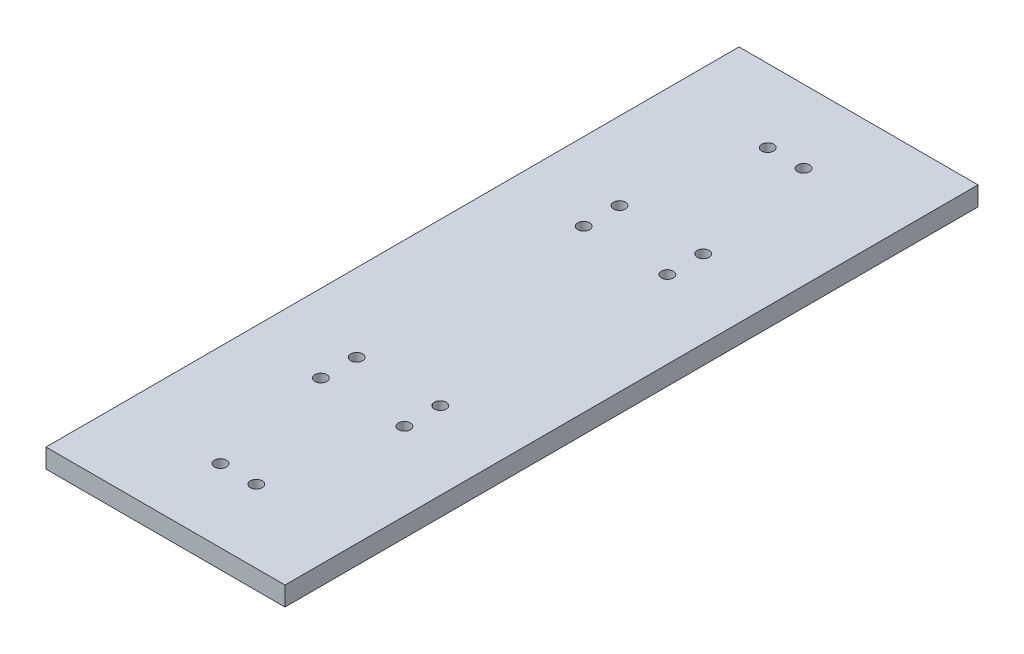
ISO-10303-21;
HEADER;
FILE_DESCRIPTION(('STEP AP214'),'2;1');
FILE_NAME('part.step','',(''),(''),'','','');
FILE_SCHEMA(('AUTOMOTIVE_DESIGN { 1 0 10303 214 1 1 1 1 }'));
ENDSEC;
DATA;
#1=APPLICATION_CONTEXT('core data for automotive mechanical design processes');
#2=APPLICATION_PROTOCOL_DEFINITION('international standard','automotive_design',2000,#1);
#3=PRODUCT_CONTEXT('',#1,'mechanical');
#4=PRODUCT('Part','Part','',(#3));
#5=PRODUCT_RELATED_PRODUCT_CATEGORY('part','',(#4));
#6=PRODUCT_DEFINITION_FORMATION('','',#4);
#7=PRODUCT_DEFINITION_CONTEXT('part definition',#1,'design');
#8=PRODUCT_DEFINITION('design','',#6,#7);
#9=PRODUCT_DEFINITION_SHAPE('','',#8);
#10=(LENGTH_UNIT() NAMED_UNIT(*) SI_UNIT(.MILLI.,.METRE.));
#11=(NAMED_UNIT(*) PLANE_ANGLE_UNIT() SI_UNIT($,.RADIAN.));
#12=(NAMED_UNIT(*) SI_UNIT($,.STERADIAN.) SOLID_ANGLE_UNIT());
#13=UNCERTAINTY_MEASURE_WITH_UNIT(LENGTH_MEASURE(1.E-05),#10,'distance_accuracy_value','');
#14=(GEOMETRIC_REPRESENTATION_CONTEXT(3) GLOBAL_UNCERTAINTY_ASSIGNED_CONTEXT((#13)) GLOBAL_UNIT_ASSIGNED_CONTEXT((#10,
#11,#12)) REPRESENTATION_CONTEXT('',''));
#15=CARTESIAN_POINT('',(0.,0.,0.));
#16=DIRECTION('',(0.,0.,1.));
#17=DIRECTION('',(1.,0.,0.));
#18=AXIS2_PLACEMENT_3D('',#15,#16,#17);
#19=CARTESIAN_POINT('',(-50.,8.,145.));
#20=DIRECTION('',(1.,0.,0.));
#21=DIRECTION('',(0.,0.,-1.));
#22=AXIS2_PLACEMENT_3D('',#19,#20,#21);
#23=PLANE('',#22);
#24=DIRECTION('',(0.,0.,1.));
#25=VECTOR('',#24,1.);
#26=CARTESIAN_POINT('',(-50.,0.,145.));
#27=LINE('',#26,#25);
#28=CARTESIAN_POINT('',(-50.,0.,-145.));
#29=VERTEX_POINT('',#28);
#30=CARTESIAN_POINT('',(-50.,0.,145.));
#31=VERTEX_POINT('',#30);
#32=EDGE_CURVE('E99',#29,#31,#27,.T.);
#33=ORIENTED_EDGE('',*,*,#32,.T.);
#34=DIRECTION('',(0.,-1.,0.));
#35=VECTOR('',#34,1.);
#36=CARTESIAN_POINT('',(-50.,8.,145.));
#37=LINE('',#36,#35);
#38=CARTESIAN_POINT('',(-50.,8.,145.));
#39=VERTEX_POINT('',#38);
#40=EDGE_CURVE('E11',#39,#31,#37,.T.);
#41=ORIENTED_EDGE('',*,*,#40,.F.);
#42=DIRECTION('',(0.,0.,1.));
#43=VECTOR('',#42,1.);
#44=CARTESIAN_POINT('',(-50.,8.,145.));
#45=LINE('',#44,#43);
#46=CARTESIAN_POINT('',(-50.,8.,-145.));
#47=VERTEX_POINT('',#46);
#48=EDGE_CURVE('E86',#47,#39,#45,.T.);
#49=ORIENTED_EDGE('',*,*,#48,.F.);
#50=DIRECTION('',(0.,-1.,0.));
#51=VECTOR('',#50,1.);
#52=CARTESIAN_POINT('',(-50.,8.,-145.));
#53=LINE('',#52,#51);
#54=EDGE_CURVE('E95',#47,#29,#53,.T.);
#55=ORIENTED_EDGE('',*,*,#54,.T.);
#56=EDGE_LOOP('',(#33,#41,#49,#55));
#57=FACE_BOUND('',#56,.T.);
#58=ADVANCED_FACE('F33',(#57),#23,.F.);
#59=CARTESIAN_POINT('',(50.,8.,145.));
#60=DIRECTION('',(0.,0.,-1.));
#61=DIRECTION('',(-1.,0.,0.));
#62=AXIS2_PLACEMENT_3D('',#59,#60,#61);
#63=PLANE('',#62);
#64=DIRECTION('',(1.,0.,0.));
#65=VECTOR('',#64,1.);
#66=CARTESIAN_POINT('',(50.,0.,145.));
#67=LINE('',#66,#65);
#68=CARTESIAN_POINT('',(50.,0.,145.));
#69=VERTEX_POINT('',#68);
#70=EDGE_CURVE('E90',#31,#69,#67,.T.);
#71=ORIENTED_EDGE('',*,*,#70,.T.);
#72=DIRECTION('',(0.,-1.,0.));
#73=VECTOR('',#72,1.);
#74=CARTESIAN_POINT('',(50.,8.,145.));
#75=LINE('',#74,#73);
#76=CARTESIAN_POINT('',(50.,8.,145.));
#77=VERTEX_POINT('',#76);
#78=EDGE_CURVE('E42',#77,#69,#75,.T.);
#79=ORIENTED_EDGE('',*,*,#78,.F.);
#80=DIRECTION('',(1.,0.,0.));
#81=VECTOR('',#80,1.);
#82=CARTESIAN_POINT('',(50.,8.,145.));
#83=LINE('',#82,#81);
#84=EDGE_CURVE('E81',#39,#77,#83,.T.);
#85=ORIENTED_EDGE('',*,*,#84,.F.);
#86=ORIENTED_EDGE('',*,*,#40,.T.);
#87=EDGE_LOOP('',(#71,#79,#85,#86));
#88=FACE_BOUND('',#87,.T.);
#89=ADVANCED_FACE('F89',(#88),#63,.F.);
#90=CARTESIAN_POINT('',(50.,8.,145.));
#91=DIRECTION('',(-1.,0.,0.));
#92=DIRECTION('',(0.,0.,1.));
#93=AXIS2_PLACEMENT_3D('',#90,#91,#92);
#94=PLANE('',#93);
#95=DIRECTION('',(0.,0.,-1.));
#96=VECTOR('',#95,1.);
#97=CARTESIAN_POINT('',(50.,0.,145.));
#98=LINE('',#97,#96);
#99=CARTESIAN_POINT('',(50.,0.,-145.));
#100=VERTEX_POINT('',#99);
#101=EDGE_CURVE('E68',#69,#100,#98,.T.);
#102=ORIENTED_EDGE('',*,*,#101,.T.);
#103=DIRECTION('',(0.,-1.,0.));
#104=VECTOR('',#103,1.);
#105=CARTESIAN_POINT('',(50.,8.,-145.));
#106=LINE('',#105,#104);
#107=CARTESIAN_POINT('',(50.,8.,-145.));
#108=VERTEX_POINT('',#107);
#109=EDGE_CURVE('E91',#108,#100,#106,.T.);
#110=ORIENTED_EDGE('',*,*,#109,.F.);
#111=DIRECTION('',(0.,0.,-1.));
#112=VECTOR('',#111,1.);
#113=CARTESIAN_POINT('',(50.,8.,145.));
#114=LINE('',#113,#112);
#115=EDGE_CURVE('E84',#77,#108,#114,.T.);
#116=ORIENTED_EDGE('',*,*,#115,.F.);
#117=ORIENTED_EDGE('',*,*,#78,.T.);
#118=EDGE_LOOP('',(#102,#110,#116,#117));
#119=FACE_BOUND('',#118,.T.);
#120=ADVANCED_FACE('F93',(#119),#94,.F.);
#121=CARTESIAN_POINT('',(50.,8.,-145.));
#122=DIRECTION('',(0.,0.,1.));
#123=DIRECTION('',(1.,0.,0.));
#124=AXIS2_PLACEMENT_3D('',#121,#122,#123);
#125=PLANE('',#124);
#126=DIRECTION('',(-1.,0.,0.));
#127=VECTOR('',#126,1.);
#128=CARTESIAN_POINT('',(50.,0.,-145.));
#129=LINE('',#128,#127);
#130=EDGE_CURVE('E74',#100,#29,#129,.T.);
#131=ORIENTED_EDGE('',*,*,#130,.T.);
#132=ORIENTED_EDGE('',*,*,#54,.F.);
#133=DIRECTION('',(-1.,0.,0.));
#134=VECTOR('',#133,1.);
#135=CARTESIAN_POINT('',(50.,8.,-145.));
#136=LINE('',#135,#134);
#137=EDGE_CURVE('E51',#108,#47,#136,.T.);
#138=ORIENTED_EDGE('',*,*,#137,.F.);
#139=ORIENTED_EDGE('',*,*,#109,.T.);
#140=EDGE_LOOP('',(#131,#132,#138,#139));
#141=FACE_BOUND('',#140,.T.);
#142=ADVANCED_FACE('F139',(#141),#125,.F.);
#143=CARTESIAN_POINT('',(0.,8.,0.));
#144=DIRECTION('',(0.,1.,0.));
#145=DIRECTION('',(0.,0.,1.));
#146=AXIS2_PLACEMENT_3D('',#143,#144,#145);
#147=PLANE('',#146);
#148=CARTESIAN_POINT('',(-17.499999999999,7.99999999999997,-62.5000000000053));
#149=DIRECTION('',(0.,1.,0.));
#150=DIRECTION('',(0.,0.,-1.));
#151=AXIS2_PLACEMENT_3D('',#148,#149,#150);
#152=CIRCLE('',#151,2.50000000000002);
#153=CARTESIAN_POINT('',(-17.499999999999,7.99999999999997,-65.0000000000053));
#154=VERTEX_POINT('',#153);
#155=EDGE_CURVE('E300',#154,#154,#152,.T.);
#156=ORIENTED_EDGE('',*,*,#155,.F.);
#157=EDGE_LOOP('',(#156));
#158=FACE_BOUND('',#157,.T.);
#159=CARTESIAN_POINT('',(-17.4999999999988,8.,62.5000000000053));
#160=DIRECTION('',(0.,-1.,0.));
#161=DIRECTION('',(0.,0.,1.));
#162=AXIS2_PLACEMENT_3D('',#159,#160,#161);
#163=CIRCLE('',#162,2.50000000000002);
#164=CARTESIAN_POINT('',(-17.4999999999988,8.,65.0000000000053));
#165=VERTEX_POINT('',#164);
#166=EDGE_CURVE('E304',#165,#165,#163,.T.);
#167=ORIENTED_EDGE('',*,*,#166,.T.);
#168=EDGE_LOOP('',(#167));
#169=FACE_BOUND('',#168,.T.);
#170=CARTESIAN_POINT('',(-17.4999999999989,7.99999999999998,-47.5000000000053));
#171=DIRECTION('',(0.,1.,0.));
#172=DIRECTION('',(0.,0.,-1.));
#173=AXIS2_PLACEMENT_3D('',#170,#171,#172);
#174=CIRCLE('',#173,2.50000000000002);
#175=CARTESIAN_POINT('',(-17.4999999999989,7.99999999999998,-50.0000000000053));
#176=VERTEX_POINT('',#175);
#177=EDGE_CURVE('E313',#176,#176,#174,.T.);
#178=ORIENTED_EDGE('',*,*,#177,.F.);
#179=EDGE_LOOP('',(#178));
#180=FACE_BOUND('',#179,.T.);
#181=CARTESIAN_POINT('',(-17.4999999999988,8.,47.5000000000053));
#182=DIRECTION('',(0.,-1.,0.));
#183=DIRECTION('',(0.,0.,1.));
#184=AXIS2_PLACEMENT_3D('',#181,#182,#183);
#185=CIRCLE('',#184,2.50000000000002);
#186=CARTESIAN_POINT('',(-17.4999999999988,8.,50.0000000000053));
#187=VERTEX_POINT('',#186);
#188=EDGE_CURVE('E319',#187,#187,#185,.T.);
#189=ORIENTED_EDGE('',*,*,#188,.T.);
#190=EDGE_LOOP('',(#189));
#191=FACE_BOUND('',#190,.T.);
#192=CARTESIAN_POINT('',(-7.50000000000114,8.00000000000484,-114.5));
#193=DIRECTION('',(0.,-1.,0.));
#194=DIRECTION('',(0.,0.,1.));
#195=AXIS2_PLACEMENT_3D('',#192,#193,#194);
#196=CIRCLE('',#195,2.49893884327289);
#197=CARTESIAN_POINT('',(-7.50000000000113,8.00000000000484,-112.001061156727));
#198=VERTEX_POINT('',#197);
#199=EDGE_CURVE('E325',#198,#198,#196,.T.);
#200=ORIENTED_EDGE('',*,*,#199,.T.);
#201=EDGE_LOOP('',(#200));
#202=FACE_BOUND('',#201,.T.);
#203=CARTESIAN_POINT('',(-7.50000000000095,8.00000000000488,114.5));
#204=DIRECTION('',(0.,1.,0.));
#205=DIRECTION('',(0.,0.,-1.));
#206=AXIS2_PLACEMENT_3D('',#203,#204,#205);
#207=CIRCLE('',#206,2.49893884327289);
#208=CARTESIAN_POINT('',(-7.50000000000095,8.00000000000488,112.001061156727));
#209=VERTEX_POINT('',#208);
#210=EDGE_CURVE('E331',#209,#209,#207,.T.);
#211=ORIENTED_EDGE('',*,*,#210,.F.);
#212=EDGE_LOOP('',(#211));
#213=FACE_BOUND('',#212,.T.);
#214=CARTESIAN_POINT('',(17.499999999999,7.99999999999997,-62.5000000000053));
#215=DIRECTION('',(0.,-1.,0.));
#216=DIRECTION('',(0.,0.,-1.));
#217=AXIS2_PLACEMENT_3D('',#214,#215,#216);
#218=CIRCLE('',#217,2.50000000000002);
#219=CARTESIAN_POINT('',(17.499999999999,7.99999999999997,-65.0000000000053));
#220=VERTEX_POINT('',#219);
#221=EDGE_CURVE('E337',#220,#220,#218,.T.);
#222=ORIENTED_EDGE('',*,*,#221,.T.);
#223=EDGE_LOOP('',(#222));
#224=FACE_BOUND('',#223,.T.);
#225=CARTESIAN_POINT('',(17.4999999999989,7.99999999999998,-47.5000000000053));
#226=DIRECTION('',(0.,-1.,0.));
#227=DIRECTION('',(0.,0.,-1.));
#228=AXIS2_PLACEMENT_3D('',#225,#226,#227);
#229=CIRCLE('',#228,2.50000000000002);
#230=CARTESIAN_POINT('',(17.4999999999989,7.99999999999998,-50.0000000000053));
#231=VERTEX_POINT('',#230);
#232=EDGE_CURVE('E343',#231,#231,#229,.T.);
#233=ORIENTED_EDGE('',*,*,#232,.T.);
#234=EDGE_LOOP('',(#233));
#235=FACE_BOUND('',#234,.T.);
#236=CARTESIAN_POINT('',(7.50000000000114,8.00000000000484,-114.5));
#237=DIRECTION('',(0.,1.,0.));
#238=DIRECTION('',(0.,0.,1.));
#239=AXIS2_PLACEMENT_3D('',#236,#237,#238);
#240=CIRCLE('',#239,2.49893884327289);
#241=CARTESIAN_POINT('',(7.50000000000113,8.00000000000484,-112.001061156727));
#242=VERTEX_POINT('',#241);
#243=EDGE_CURVE('E348',#242,#242,#240,.T.);
#244=ORIENTED_EDGE('',*,*,#243,.F.);
#245=EDGE_LOOP('',(#244));
#246=FACE_BOUND('',#245,.T.);
#247=CARTESIAN_POINT('',(17.4999999999988,8.,62.5000000000053));
#248=DIRECTION('',(0.,1.,0.));
#249=DIRECTION('',(0.,0.,1.));
#250=AXIS2_PLACEMENT_3D('',#247,#248,#249);
#251=CIRCLE('',#250,2.50000000000002);
#252=CARTESIAN_POINT('',(17.4999999999988,8.,65.0000000000053));
#253=VERTEX_POINT('',#252);
#254=EDGE_CURVE('E110',#253,#253,#251,.T.);
#255=ORIENTED_EDGE('',*,*,#254,.F.);
#256=EDGE_LOOP('',(#255));
#257=FACE_BOUND('',#256,.T.);
#258=CARTESIAN_POINT('',(17.4999999999988,8.,47.5000000000053));
#259=DIRECTION('',(0.,1.,0.));
#260=DIRECTION('',(0.,0.,1.));
#261=AXIS2_PLACEMENT_3D('',#258,#259,#260);
#262=CIRCLE('',#261,2.50000000000002);
#263=CARTESIAN_POINT('',(17.4999999999988,8.,50.0000000000053));
#264=VERTEX_POINT('',#263);
#265=EDGE_CURVE('E109',#264,#264,#262,.T.);
#266=ORIENTED_EDGE('',*,*,#265,.F.);
#267=EDGE_LOOP('',(#266));
#268=FACE_BOUND('',#267,.T.);
#269=CARTESIAN_POINT('',(7.50000000000095,8.00000000000488,114.5));
#270=DIRECTION('',(0.,-1.,0.));
#271=DIRECTION('',(0.,0.,-1.));
#272=AXIS2_PLACEMENT_3D('',#269,#270,#271);
#273=CIRCLE('',#272,2.49893884327289);
#274=CARTESIAN_POINT('',(7.50000000000095,8.00000000000488,112.001061156727));
#275=VERTEX_POINT('',#274);
#276=EDGE_CURVE('E102',#275,#275,#273,.T.);
#277=ORIENTED_EDGE('',*,*,#276,.T.);
#278=EDGE_LOOP('',(#277));
#279=FACE_BOUND('',#278,.T.);
#280=ORIENTED_EDGE('',*,*,#48,.T.);
#281=ORIENTED_EDGE('',*,*,#84,.T.);
#282=ORIENTED_EDGE('',*,*,#115,.T.);
#283=ORIENTED_EDGE('',*,*,#137,.T.);
#284=EDGE_LOOP('',(#280,#281,#282,#283));
#285=FACE_BOUND('',#284,.T.);
#286=ADVANCED_FACE('F82',(#158,#169,#180,#191,#202,#213,#224,#235,#246,#257,#268,#279,#285),
#147,.T.);
#287=CARTESIAN_POINT('',(0.,0.,0.));
#288=DIRECTION('',(0.,1.,0.));
#289=DIRECTION('',(0.,0.,1.));
#290=AXIS2_PLACEMENT_3D('',#287,#288,#289);
#291=PLANE('',#290);
#292=CARTESIAN_POINT('',(-17.499999999999,0.,-62.5000000000053));
#293=DIRECTION('',(0.,1.,0.));
#294=DIRECTION('',(0.,0.,-1.));
#295=AXIS2_PLACEMENT_3D('',#292,#293,#294);
#296=CIRCLE('',#295,2.50000000000002);
#297=CARTESIAN_POINT('',(-17.499999999999,0.,-65.0000000000053));
#298=VERTEX_POINT('',#297);
#299=EDGE_CURVE('E303',#298,#298,#296,.T.);
#300=ORIENTED_EDGE('',*,*,#299,.T.);
#301=EDGE_LOOP('',(#300));
#302=FACE_BOUND('',#301,.T.);
#303=CARTESIAN_POINT('',(-17.4999999999988,0.,62.5000000000053));
#304=DIRECTION('',(0.,-1.,0.));
#305=DIRECTION('',(0.,0.,1.));
#306=AXIS2_PLACEMENT_3D('',#303,#304,#305);
#307=CIRCLE('',#306,2.50000000000002);
#308=CARTESIAN_POINT('',(-17.4999999999988,0.,65.0000000000053));
#309=VERTEX_POINT('',#308);
#310=EDGE_CURVE('E307',#309,#309,#307,.T.);
#311=ORIENTED_EDGE('',*,*,#310,.F.);
#312=EDGE_LOOP('',(#311));
#313=FACE_BOUND('',#312,.T.);
#314=CARTESIAN_POINT('',(-17.4999999999989,0.,-47.5000000000053));
#315=DIRECTION('',(0.,1.,0.));
#316=DIRECTION('',(0.,0.,-1.));
#317=AXIS2_PLACEMENT_3D('',#314,#315,#316);
#318=CIRCLE('',#317,2.50000000000002);
#319=CARTESIAN_POINT('',(-17.4999999999989,0.,-50.0000000000053));
#320=VERTEX_POINT('',#319);
#321=EDGE_CURVE('E316',#320,#320,#318,.T.);
#322=ORIENTED_EDGE('',*,*,#321,.T.);
#323=EDGE_LOOP('',(#322));
#324=FACE_BOUND('',#323,.T.);
#325=CARTESIAN_POINT('',(-17.4999999999988,0.,47.5000000000053));
#326=DIRECTION('',(0.,-1.,0.));
#327=DIRECTION('',(0.,0.,1.));
#328=AXIS2_PLACEMENT_3D('',#325,#326,#327);
#329=CIRCLE('',#328,2.50000000000002);
#330=CARTESIAN_POINT('',(-17.4999999999988,0.,50.0000000000053));
#331=VERTEX_POINT('',#330);
#332=EDGE_CURVE('E322',#331,#331,#329,.T.);
#333=ORIENTED_EDGE('',*,*,#332,.F.);
#334=EDGE_LOOP('',(#333));
#335=FACE_BOUND('',#334,.T.);
#336=CARTESIAN_POINT('',(-7.50000000000114,4.83413309382286E-12,-114.5));
#337=DIRECTION('',(0.,-1.,0.));
#338=DIRECTION('',(0.,0.,1.));
#339=AXIS2_PLACEMENT_3D('',#336,#337,#338);
#340=CIRCLE('',#339,2.49893884327289);
#341=CARTESIAN_POINT('',(-7.50000000000113,4.83524284559923E-12,-112.001061156727));
#342=VERTEX_POINT('',#341);
#343=EDGE_CURVE('E328',#342,#342,#340,.T.);
#344=ORIENTED_EDGE('',*,*,#343,.F.);
#345=EDGE_LOOP('',(#344));
#346=FACE_BOUND('',#345,.T.);
#347=CARTESIAN_POINT('',(-7.50000000000095,4.88498130835069E-12,114.5));
#348=DIRECTION('',(0.,1.,0.));
#349=DIRECTION('',(0.,0.,-1.));
#350=AXIS2_PLACEMENT_3D('',#347,#348,#349);
#351=CIRCLE('',#350,2.49893884327289);
#352=CARTESIAN_POINT('',(-7.50000000000095,4.88498130835069E-12,112.001061156727));
#353=VERTEX_POINT('',#352);
#354=EDGE_CURVE('E334',#353,#353,#351,.T.);
#355=ORIENTED_EDGE('',*,*,#354,.T.);
#356=EDGE_LOOP('',(#355));
#357=FACE_BOUND('',#356,.T.);
#358=CARTESIAN_POINT('',(17.499999999999,0.,-62.5000000000053));
#359=DIRECTION('',(0.,-1.,0.));
#360=DIRECTION('',(0.,0.,-1.));
#361=AXIS2_PLACEMENT_3D('',#358,#359,#360);
#362=CIRCLE('',#361,2.50000000000002);
#363=CARTESIAN_POINT('',(17.499999999999,0.,-65.0000000000053));
#364=VERTEX_POINT('',#363);
#365=EDGE_CURVE('E340',#364,#364,#362,.T.);
#366=ORIENTED_EDGE('',*,*,#365,.F.);
#367=EDGE_LOOP('',(#366));
#368=FACE_BOUND('',#367,.T.);
#369=CARTESIAN_POINT('',(17.4999999999989,0.,-47.5000000000053));
#370=DIRECTION('',(0.,-1.,0.));
#371=DIRECTION('',(0.,0.,-1.));
#372=AXIS2_PLACEMENT_3D('',#369,#370,#371);
#373=CIRCLE('',#372,2.50000000000002);
#374=CARTESIAN_POINT('',(17.4999999999989,0.,-50.0000000000053));
#375=VERTEX_POINT('',#374);
#376=EDGE_CURVE('E346',#375,#375,#373,.T.);
#377=ORIENTED_EDGE('',*,*,#376,.F.);
#378=EDGE_LOOP('',(#377));
#379=FACE_BOUND('',#378,.T.);
#380=CARTESIAN_POINT('',(7.50000000000114,4.83413309382286E-12,-114.5));
#381=DIRECTION('',(0.,1.,0.));
#382=DIRECTION('',(0.,0.,1.));
#383=AXIS2_PLACEMENT_3D('',#380,#381,#382);
#384=CIRCLE('',#383,2.49893884327289);
#385=CARTESIAN_POINT('',(7.50000000000113,4.83524284559923E-12,-112.001061156727));
#386=VERTEX_POINT('',#385);
#387=EDGE_CURVE('E121',#386,#386,#384,.T.);
#388=ORIENTED_EDGE('',*,*,#387,.T.);
#389=EDGE_LOOP('',(#388));
#390=FACE_BOUND('',#389,.T.);
#391=CARTESIAN_POINT('',(17.4999999999988,0.,62.5000000000053));
#392=DIRECTION('',(0.,1.,0.));
#393=DIRECTION('',(0.,0.,1.));
#394=AXIS2_PLACEMENT_3D('',#391,#392,#393);
#395=CIRCLE('',#394,2.50000000000002);
#396=CARTESIAN_POINT('',(17.4999999999988,0.,65.0000000000053));
#397=VERTEX_POINT('',#396);
#398=EDGE_CURVE('E36',#397,#397,#395,.T.);
#399=ORIENTED_EDGE('',*,*,#398,.T.);
#400=EDGE_LOOP('',(#399));
#401=FACE_BOUND('',#400,.T.);
#402=CARTESIAN_POINT('',(17.4999999999988,0.,47.5000000000053));
#403=DIRECTION('',(0.,1.,0.));
#404=DIRECTION('',(0.,0.,1.));
#405=AXIS2_PLACEMENT_3D('',#402,#403,#404);
#406=CIRCLE('',#405,2.50000000000002);
#407=CARTESIAN_POINT('',(17.4999999999988,0.,50.0000000000053));
#408=VERTEX_POINT('',#407);
#409=EDGE_CURVE('E107',#408,#408,#406,.T.);
#410=ORIENTED_EDGE('',*,*,#409,.T.);
#411=EDGE_LOOP('',(#410));
#412=FACE_BOUND('',#411,.T.);
#413=CARTESIAN_POINT('',(7.50000000000095,4.88498130835069E-12,114.5));
#414=DIRECTION('',(0.,-1.,0.));
#415=DIRECTION('',(0.,0.,-1.));
#416=AXIS2_PLACEMENT_3D('',#413,#414,#415);
#417=CIRCLE('',#416,2.49893884327289);
#418=CARTESIAN_POINT('',(7.50000000000095,4.88498130835069E-12,112.001061156727));
#419=VERTEX_POINT('',#418);
#420=EDGE_CURVE('E114',#419,#419,#417,.T.);
#421=ORIENTED_EDGE('',*,*,#420,.F.);
#422=EDGE_LOOP('',(#421));
#423=FACE_BOUND('',#422,.T.);
#424=ORIENTED_EDGE('',*,*,#32,.F.);
#425=ORIENTED_EDGE('',*,*,#130,.F.);
#426=ORIENTED_EDGE('',*,*,#101,.F.);
#427=ORIENTED_EDGE('',*,*,#70,.F.);
#428=EDGE_LOOP('',(#424,#425,#426,#427));
#429=FACE_BOUND('',#428,.T.);
#430=ADVANCED_FACE('F132',(#302,#313,#324,#335,#346,#357,#368,#379,#390,#401,#412,#423,#429),
#291,.F.);
#431=CARTESIAN_POINT('',(7.50000000000095,8.00000000000488,114.5));
#432=DIRECTION('',(0.,-1.,0.));
#433=DIRECTION('',(0.,0.,-1.));
#434=AXIS2_PLACEMENT_3D('',#431,#432,#433);
#435=CYLINDRICAL_SURFACE('',#434,2.49893884327289);
#436=ORIENTED_EDGE('',*,*,#276,.F.);
#437=EDGE_LOOP('',(#436));
#438=FACE_BOUND('',#437,.T.);
#439=ORIENTED_EDGE('',*,*,#420,.T.);
#440=EDGE_LOOP('',(#439));
#441=FACE_BOUND('',#440,.T.);
#442=ADVANCED_FACE('F130',(#438,#441),#435,.F.);
#443=CARTESIAN_POINT('',(17.4999999999988,8.5000000000092,47.5000000000053));
#444=DIRECTION('',(0.,-1.,0.));
#445=DIRECTION('',(0.,0.,-1.));
#446=AXIS2_PLACEMENT_3D('',#443,#444,#445);
#447=CYLINDRICAL_SURFACE('',#446,2.50000000000002);
#448=ORIENTED_EDGE('',*,*,#265,.T.);
#449=EDGE_LOOP('',(#448));
#450=FACE_BOUND('',#449,.T.);
#451=ORIENTED_EDGE('',*,*,#409,.F.);
#452=EDGE_LOOP('',(#451));
#453=FACE_BOUND('',#452,.T.);
#454=ADVANCED_FACE('F173',(#450,#453),#447,.F.);
#455=CARTESIAN_POINT('',(17.4999999999988,8.5000000000092,62.5000000000053));
#456=DIRECTION('',(0.,-1.,0.));
#457=DIRECTION('',(0.,0.,-1.));
#458=AXIS2_PLACEMENT_3D('',#455,#456,#457);
#459=CYLINDRICAL_SURFACE('',#458,2.50000000000002);
#460=ORIENTED_EDGE('',*,*,#254,.T.);
#461=EDGE_LOOP('',(#460));
#462=FACE_BOUND('',#461,.T.);
#463=ORIENTED_EDGE('',*,*,#398,.F.);
#464=EDGE_LOOP('',(#463));
#465=FACE_BOUND('',#464,.T.);
#466=ADVANCED_FACE('F184',(#462,#465),#459,.F.);
#467=CARTESIAN_POINT('',(7.50000000000114,8.00000000000484,-114.5));
#468=DIRECTION('',(0.,-1.,0.));
#469=DIRECTION('',(0.,0.,1.));
#470=AXIS2_PLACEMENT_3D('',#467,#468,#469);
#471=CYLINDRICAL_SURFACE('',#470,2.49893884327289);
#472=ORIENTED_EDGE('',*,*,#243,.T.);
#473=EDGE_LOOP('',(#472));
#474=FACE_BOUND('',#473,.T.);
#475=ORIENTED_EDGE('',*,*,#387,.F.);
#476=EDGE_LOOP('',(#475));
#477=FACE_BOUND('',#476,.T.);
#478=ADVANCED_FACE('F194',(#474,#477),#471,.F.);
#479=CARTESIAN_POINT('',(17.4999999999989,8.50000000000918,-47.5000000000053));
#480=DIRECTION('',(0.,-1.,0.));
#481=DIRECTION('',(0.,0.,1.));
#482=AXIS2_PLACEMENT_3D('',#479,#480,#481);
#483=CYLINDRICAL_SURFACE('',#482,2.50000000000002);
#484=ORIENTED_EDGE('',*,*,#232,.F.);
#485=EDGE_LOOP('',(#484));
#486=FACE_BOUND('',#485,.T.);
#487=ORIENTED_EDGE('',*,*,#376,.T.);
#488=EDGE_LOOP('',(#487));
#489=FACE_BOUND('',#488,.T.);
#490=ADVANCED_FACE('F203',(#486,#489),#483,.F.);
#491=CARTESIAN_POINT('',(17.499999999999,8.50000000000917,-62.5000000000053));
#492=DIRECTION('',(0.,-1.,0.));
#493=DIRECTION('',(0.,0.,1.));
#494=AXIS2_PLACEMENT_3D('',#491,#492,#493);
#495=CYLINDRICAL_SURFACE('',#494,2.50000000000002);
#496=ORIENTED_EDGE('',*,*,#221,.F.);
#497=EDGE_LOOP('',(#496));
#498=FACE_BOUND('',#497,.T.);
#499=ORIENTED_EDGE('',*,*,#365,.T.);
#500=EDGE_LOOP('',(#499));
#501=FACE_BOUND('',#500,.T.);
#502=ADVANCED_FACE('F213',(#498,#501),#495,.F.);
#503=CARTESIAN_POINT('',(-7.50000000000095,8.00000000000488,114.5));
#504=DIRECTION('',(0.,-1.,0.));
#505=DIRECTION('',(0.,0.,-1.));
#506=AXIS2_PLACEMENT_3D('',#503,#504,#505);
#507=CYLINDRICAL_SURFACE('',#506,2.49893884327289);
#508=ORIENTED_EDGE('',*,*,#210,.T.);
#509=EDGE_LOOP('',(#508));
#510=FACE_BOUND('',#509,.T.);
#511=ORIENTED_EDGE('',*,*,#354,.F.);
#512=EDGE_LOOP('',(#511));
#513=FACE_BOUND('',#512,.T.);
#514=ADVANCED_FACE('F223',(#510,#513),#507,.F.);
#515=CARTESIAN_POINT('',(-7.50000000000114,8.00000000000484,-114.5));
#516=DIRECTION('',(0.,-1.,0.));
#517=DIRECTION('',(0.,0.,1.));
#518=AXIS2_PLACEMENT_3D('',#515,#516,#517);
#519=CYLINDRICAL_SURFACE('',#518,2.49893884327289);
#520=ORIENTED_EDGE('',*,*,#199,.F.);
#521=EDGE_LOOP('',(#520));
#522=FACE_BOUND('',#521,.T.);
#523=ORIENTED_EDGE('',*,*,#343,.T.);
#524=EDGE_LOOP('',(#523));
#525=FACE_BOUND('',#524,.T.);
#526=ADVANCED_FACE('F243',(#522,#525),#519,.F.);
#527=CARTESIAN_POINT('',(-17.4999999999988,8.5000000000092,47.5000000000053));
#528=DIRECTION('',(0.,-1.,0.));
#529=DIRECTION('',(0.,0.,-1.));
#530=AXIS2_PLACEMENT_3D('',#527,#528,#529);
#531=CYLINDRICAL_SURFACE('',#530,2.50000000000002);
#532=ORIENTED_EDGE('',*,*,#188,.F.);
#533=EDGE_LOOP('',(#532));
#534=FACE_BOUND('',#533,.T.);
#535=ORIENTED_EDGE('',*,*,#332,.T.);
#536=EDGE_LOOP('',(#535));
#537=FACE_BOUND('',#536,.T.);
#538=ADVANCED_FACE('F253',(#534,#537),#531,.F.);
#539=CARTESIAN_POINT('',(-17.4999999999989,8.50000000000918,-47.5000000000053));
#540=DIRECTION('',(0.,-1.,0.));
#541=DIRECTION('',(0.,0.,1.));
#542=AXIS2_PLACEMENT_3D('',#539,#540,#541);
#543=CYLINDRICAL_SURFACE('',#542,2.50000000000002);
#544=ORIENTED_EDGE('',*,*,#177,.T.);
#545=EDGE_LOOP('',(#544));
#546=FACE_BOUND('',#545,.T.);
#547=ORIENTED_EDGE('',*,*,#321,.F.);
#548=EDGE_LOOP('',(#547));
#549=FACE_BOUND('',#548,.T.);
#550=ADVANCED_FACE('F263',(#546,#549),#543,.F.);
#551=CARTESIAN_POINT('',(-17.4999999999988,8.5000000000092,62.5000000000053));
#552=DIRECTION('',(0.,-1.,0.));
#553=DIRECTION('',(0.,0.,-1.));
#554=AXIS2_PLACEMENT_3D('',#551,#552,#553);
#555=CYLINDRICAL_SURFACE('',#554,2.50000000000002);
#556=ORIENTED_EDGE('',*,*,#166,.F.);
#557=EDGE_LOOP('',(#556));
#558=FACE_BOUND('',#557,.T.);
#559=ORIENTED_EDGE('',*,*,#310,.T.);
#560=EDGE_LOOP('',(#559));
#561=FACE_BOUND('',#560,.T.);
#562=ADVANCED_FACE('F273',(#558,#561),#555,.F.);
#563=CARTESIAN_POINT('',(-17.499999999999,8.50000000000917,-62.5000000000053));
#564=DIRECTION('',(0.,-1.,0.));
#565=DIRECTION('',(0.,0.,1.));
#566=AXIS2_PLACEMENT_3D('',#563,#564,#565);
#567=CYLINDRICAL_SURFACE('',#566,2.50000000000002);
#568=ORIENTED_EDGE('',*,*,#155,.T.);
#569=EDGE_LOOP('',(#568));
#570=FACE_BOUND('',#569,.T.);
#571=ORIENTED_EDGE('',*,*,#299,.F.);
#572=EDGE_LOOP('',(#571));
#573=FACE_BOUND('',#572,.T.);
#574=ADVANCED_FACE('F283',(#570,#573),#567,.F.);
#575=CLOSED_SHELL('',(#58,#89,#120,#142,#286,#430,#442,#454,#466,#478,#490,#502,#514,#526,#538,
#550,#562,#574));
#576=MANIFOLD_SOLID_BREP('B2',#575);
#577=ADVANCED_BREP_SHAPE_REPRESENTATION('',(#18,#576),#14);
#578=SHAPE_DEFINITION_REPRESENTATION(#9,#577);
ENDSEC;
END-ISO-10303-21;
